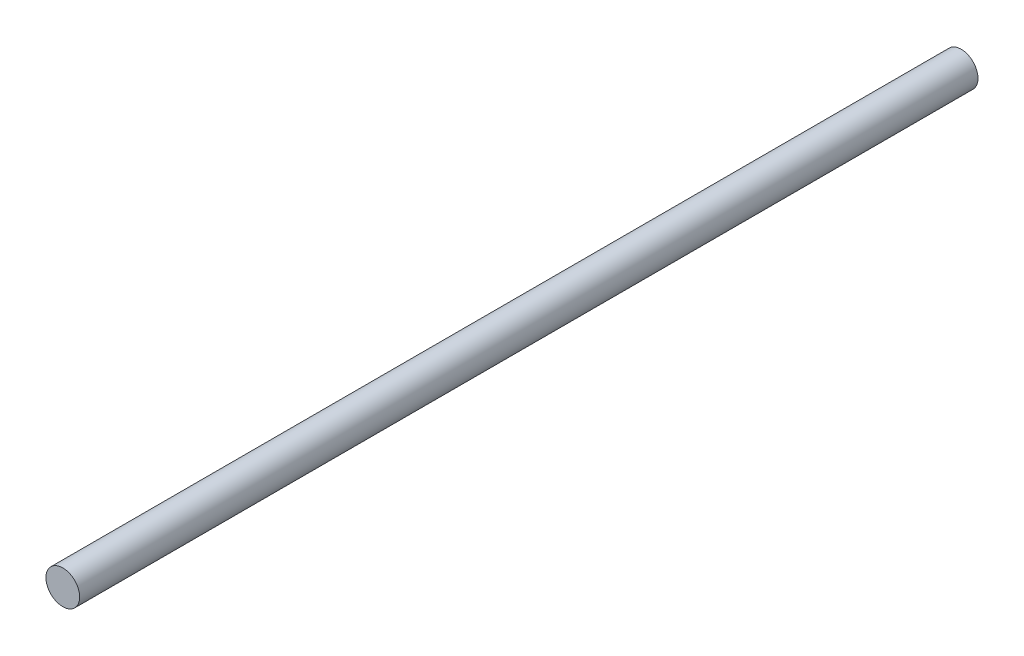
ISO-10303-21;
HEADER;
FILE_DESCRIPTION(('STEP AP214'),'2;1');
FILE_NAME('part.step','',(''),(''),'','','');
FILE_SCHEMA(('AUTOMOTIVE_DESIGN { 1 0 10303 214 1 1 1 1 }'));
ENDSEC;
DATA;
#1=APPLICATION_CONTEXT('core data for automotive mechanical design processes');
#2=APPLICATION_PROTOCOL_DEFINITION('international standard','automotive_design',2000,#1);
#3=PRODUCT_CONTEXT('',#1,'mechanical');
#4=PRODUCT('Part','Part','',(#3));
#5=PRODUCT_RELATED_PRODUCT_CATEGORY('part','',(#4));
#6=PRODUCT_DEFINITION_FORMATION('','',#4);
#7=PRODUCT_DEFINITION_CONTEXT('part definition',#1,'design');
#8=PRODUCT_DEFINITION('design','',#6,#7);
#9=PRODUCT_DEFINITION_SHAPE('','',#8);
#10=(LENGTH_UNIT() NAMED_UNIT(*) SI_UNIT(.MILLI.,.METRE.));
#11=(NAMED_UNIT(*) PLANE_ANGLE_UNIT() SI_UNIT($,.RADIAN.));
#12=(NAMED_UNIT(*) SI_UNIT($,.STERADIAN.) SOLID_ANGLE_UNIT());
#13=UNCERTAINTY_MEASURE_WITH_UNIT(LENGTH_MEASURE(1.E-05),#10,'distance_accuracy_value','');
#14=(GEOMETRIC_REPRESENTATION_CONTEXT(3) GLOBAL_UNCERTAINTY_ASSIGNED_CONTEXT((#13)) GLOBAL_UNIT_ASSIGNED_CONTEXT((#10,
#11,#12)) REPRESENTATION_CONTEXT('',''));
#15=CARTESIAN_POINT('',(0.,0.,0.));
#16=DIRECTION('',(0.,0.,1.));
#17=DIRECTION('',(1.,0.,0.));
#18=AXIS2_PLACEMENT_3D('',#15,#16,#17);
#19=CARTESIAN_POINT('',(0.,0.,320.));
#20=DIRECTION('',(0.,0.,-1.));
#21=DIRECTION('',(-1.,0.,0.));
#22=AXIS2_PLACEMENT_3D('',#19,#20,#21);
#23=CYLINDRICAL_SURFACE('',#22,6.);
#24=CARTESIAN_POINT('',(0.,0.,320.));
#25=DIRECTION('',(0.,0.,1.));
#26=DIRECTION('',(1.,0.,0.));
#27=AXIS2_PLACEMENT_3D('',#24,#25,#26);
#28=CIRCLE('',#27,6.);
#29=CARTESIAN_POINT('',(6.,0.,320.));
#30=VERTEX_POINT('',#29);
#31=EDGE_CURVE('E12',#30,#30,#28,.T.);
#32=ORIENTED_EDGE('',*,*,#31,.F.);
#33=EDGE_LOOP('',(#32));
#34=FACE_BOUND('',#33,.T.);
#35=CARTESIAN_POINT('',(0.,0.,0.));
#36=DIRECTION('',(0.,0.,1.));
#37=DIRECTION('',(1.,0.,0.));
#38=AXIS2_PLACEMENT_3D('',#35,#36,#37);
#39=CIRCLE('',#38,6.);
#40=CARTESIAN_POINT('',(6.,0.,0.));
#41=VERTEX_POINT('',#40);
#42=EDGE_CURVE('E46',#41,#41,#39,.T.);
#43=ORIENTED_EDGE('',*,*,#42,.T.);
#44=EDGE_LOOP('',(#43));
#45=FACE_BOUND('',#44,.T.);
#46=ADVANCED_FACE('F43',(#34,#45),#23,.T.);
#47=CARTESIAN_POINT('',(0.,0.,320.));
#48=DIRECTION('',(0.,0.,1.));
#49=DIRECTION('',(1.,0.,0.));
#50=AXIS2_PLACEMENT_3D('',#47,#48,#49);
#51=PLANE('',#50);
#52=ORIENTED_EDGE('',*,*,#31,.T.);
#53=EDGE_LOOP('',(#52));
#54=FACE_BOUND('',#53,.T.);
#55=ADVANCED_FACE('F58',(#54),#51,.T.);
#56=CARTESIAN_POINT('',(0.,0.,0.));
#57=DIRECTION('',(0.,0.,1.));
#58=DIRECTION('',(1.,0.,0.));
#59=AXIS2_PLACEMENT_3D('',#56,#57,#58);
#60=PLANE('',#59);
#61=ORIENTED_EDGE('',*,*,#42,.F.);
#62=EDGE_LOOP('',(#61));
#63=FACE_BOUND('',#62,.T.);
#64=ADVANCED_FACE('F56',(#63),#60,.F.);
#65=CLOSED_SHELL('',(#46,#55,#64));
#66=MANIFOLD_SOLID_BREP('B2',#65);
#67=ADVANCED_BREP_SHAPE_REPRESENTATION('',(#18,#66),#14);
#68=SHAPE_DEFINITION_REPRESENTATION(#9,#67);
ENDSEC;
END-ISO-10303-21;
